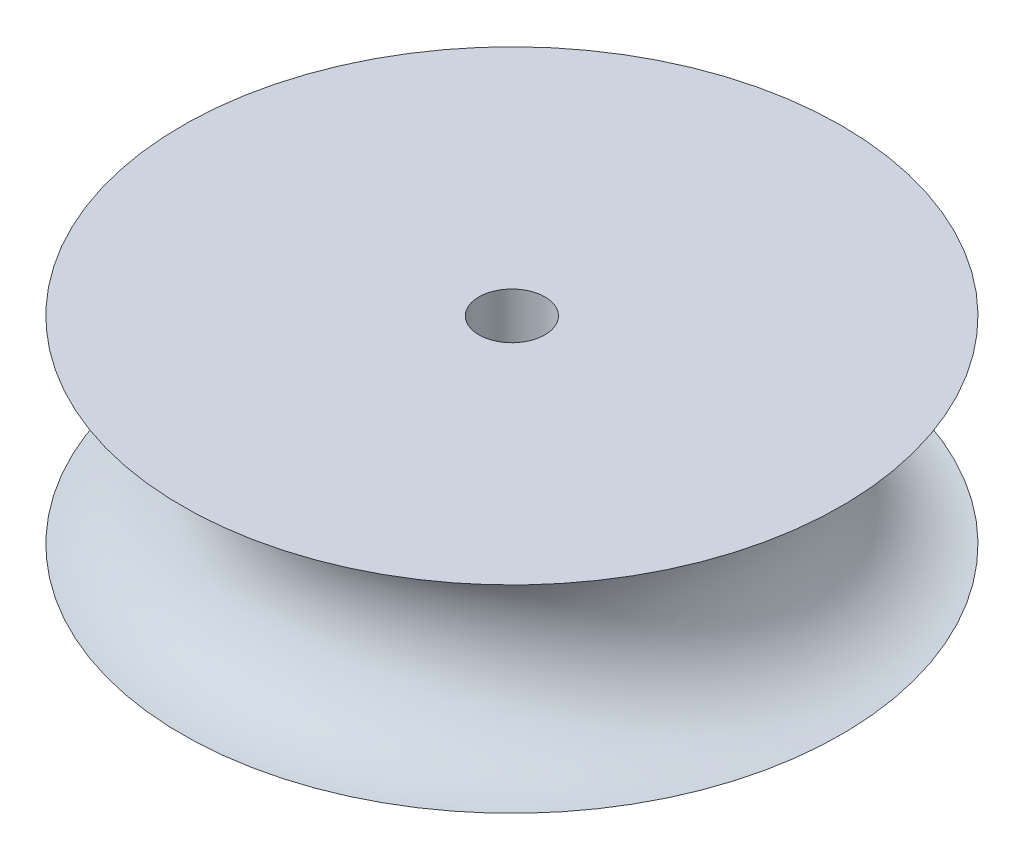
ISO-10303-21;
HEADER;
FILE_DESCRIPTION(('STEP AP214'),'2;1');
FILE_NAME('part.step','',(''),(''),'','','');
FILE_SCHEMA(('AUTOMOTIVE_DESIGN { 1 0 10303 214 1 1 1 1 }'));
ENDSEC;
DATA;
#1=APPLICATION_CONTEXT('core data for automotive mechanical design processes');
#2=APPLICATION_PROTOCOL_DEFINITION('international standard','automotive_design',2000,#1);
#3=PRODUCT_CONTEXT('',#1,'mechanical');
#4=PRODUCT('Part','Part','',(#3));
#5=PRODUCT_RELATED_PRODUCT_CATEGORY('part','',(#4));
#6=PRODUCT_DEFINITION_FORMATION('','',#4);
#7=PRODUCT_DEFINITION_CONTEXT('part definition',#1,'design');
#8=PRODUCT_DEFINITION('design','',#6,#7);
#9=PRODUCT_DEFINITION_SHAPE('','',#8);
#10=(LENGTH_UNIT() NAMED_UNIT(*) SI_UNIT(.MILLI.,.METRE.));
#11=(NAMED_UNIT(*) PLANE_ANGLE_UNIT() SI_UNIT($,.RADIAN.));
#12=(NAMED_UNIT(*) SI_UNIT($,.STERADIAN.) SOLID_ANGLE_UNIT());
#13=UNCERTAINTY_MEASURE_WITH_UNIT(LENGTH_MEASURE(1.E-05),#10,'distance_accuracy_value','');
#14=(GEOMETRIC_REPRESENTATION_CONTEXT(3) GLOBAL_UNCERTAINTY_ASSIGNED_CONTEXT((#13)) GLOBAL_UNIT_ASSIGNED_CONTEXT((#10,
#11,#12)) REPRESENTATION_CONTEXT('',''));
#15=CARTESIAN_POINT('',(0.,0.,0.));
#16=DIRECTION('',(0.,0.,1.));
#17=DIRECTION('',(1.,0.,0.));
#18=AXIS2_PLACEMENT_3D('',#15,#16,#17);
#19=CARTESIAN_POINT('',(0.,15.,0.));
#20=DIRECTION('',(0.,-1.,0.));
#21=DIRECTION('',(0.,0.,-1.));
#22=AXIS2_PLACEMENT_3D('',#19,#20,#21);
#23=TOROIDAL_SURFACE('',#22,50.,15.);
#24=CARTESIAN_POINT('',(0.,0.,0.));
#25=DIRECTION('',(0.,-1.,0.));
#26=DIRECTION('',(0.,0.,-1.));
#27=AXIS2_PLACEMENT_3D('',#24,#25,#26);
#28=CIRCLE('',#27,50.);
#29=CARTESIAN_POINT('',(0.,0.,-50.));
#30=VERTEX_POINT('',#29);
#31=EDGE_CURVE('E10',#30,#30,#28,.T.);
#32=ORIENTED_EDGE('',*,*,#31,.F.);
#33=EDGE_LOOP('',(#32));
#34=FACE_BOUND('',#33,.T.);
#35=CARTESIAN_POINT('',(0.,30.,0.));
#36=DIRECTION('',(0.,-1.,0.));
#37=DIRECTION('',(0.,0.,-1.));
#38=AXIS2_PLACEMENT_3D('',#35,#36,#37);
#39=CIRCLE('',#38,50.);
#40=CARTESIAN_POINT('',(0.,30.,-50.));
#41=VERTEX_POINT('',#40);
#42=EDGE_CURVE('E47',#41,#41,#39,.T.);
#43=ORIENTED_EDGE('',*,*,#42,.T.);
#44=EDGE_LOOP('',(#43));
#45=FACE_BOUND('',#44,.T.);
#46=ADVANCED_FACE('F33',(#34,#45),#23,.F.);
#47=CARTESIAN_POINT('',(-5.,0.,0.));
#48=DIRECTION('',(0.,1.,0.));
#49=DIRECTION('',(0.,0.,1.));
#50=AXIS2_PLACEMENT_3D('',#47,#48,#49);
#51=PLANE('',#50);
#52=CARTESIAN_POINT('',(0.,0.,0.));
#53=DIRECTION('',(0.,-1.,0.));
#54=DIRECTION('',(0.,0.,-1.));
#55=AXIS2_PLACEMENT_3D('',#52,#53,#54);
#56=CIRCLE('',#55,5.);
#57=CARTESIAN_POINT('',(0.,0.,-5.));
#58=VERTEX_POINT('',#57);
#59=EDGE_CURVE('E39',#58,#58,#56,.T.);
#60=ORIENTED_EDGE('',*,*,#59,.F.);
#61=EDGE_LOOP('',(#60));
#62=FACE_BOUND('',#61,.T.);
#63=ORIENTED_EDGE('',*,*,#31,.T.);
#64=EDGE_LOOP('',(#63));
#65=FACE_BOUND('',#64,.T.);
#66=ADVANCED_FACE('F62',(#62,#65),#51,.F.);
#67=CARTESIAN_POINT('',(0.,0.,0.));
#68=DIRECTION('',(0.,-1.,0.));
#69=DIRECTION('',(0.,0.,-1.));
#70=AXIS2_PLACEMENT_3D('',#67,#68,#69);
#71=CYLINDRICAL_SURFACE('',#70,5.);
#72=CARTESIAN_POINT('',(0.,30.,0.));
#73=DIRECTION('',(0.,-1.,0.));
#74=DIRECTION('',(0.,0.,-1.));
#75=AXIS2_PLACEMENT_3D('',#72,#73,#74);
#76=CIRCLE('',#75,5.);
#77=CARTESIAN_POINT('',(0.,30.,-5.));
#78=VERTEX_POINT('',#77);
#79=EDGE_CURVE('E43',#78,#78,#76,.T.);
#80=ORIENTED_EDGE('',*,*,#79,.F.);
#81=EDGE_LOOP('',(#80));
#82=FACE_BOUND('',#81,.T.);
#83=ORIENTED_EDGE('',*,*,#59,.T.);
#84=EDGE_LOOP('',(#83));
#85=FACE_BOUND('',#84,.T.);
#86=ADVANCED_FACE('F57',(#82,#85),#71,.F.);
#87=CARTESIAN_POINT('',(-50.,30.,0.));
#88=DIRECTION('',(0.,-1.,0.));
#89=DIRECTION('',(0.,0.,-1.));
#90=AXIS2_PLACEMENT_3D('',#87,#88,#89);
#91=PLANE('',#90);
#92=ORIENTED_EDGE('',*,*,#42,.F.);
#93=EDGE_LOOP('',(#92));
#94=FACE_BOUND('',#93,.T.);
#95=ORIENTED_EDGE('',*,*,#79,.T.);
#96=EDGE_LOOP('',(#95));
#97=FACE_BOUND('',#96,.T.);
#98=ADVANCED_FACE('F54',(#94,#97),#91,.F.);
#99=CLOSED_SHELL('',(#46,#66,#86,#98));
#100=MANIFOLD_SOLID_BREP('B2',#99);
#101=ADVANCED_BREP_SHAPE_REPRESENTATION('',(#18,#100),#14);
#102=SHAPE_DEFINITION_REPRESENTATION(#9,#101);
ENDSEC;
END-ISO-10303-21;
